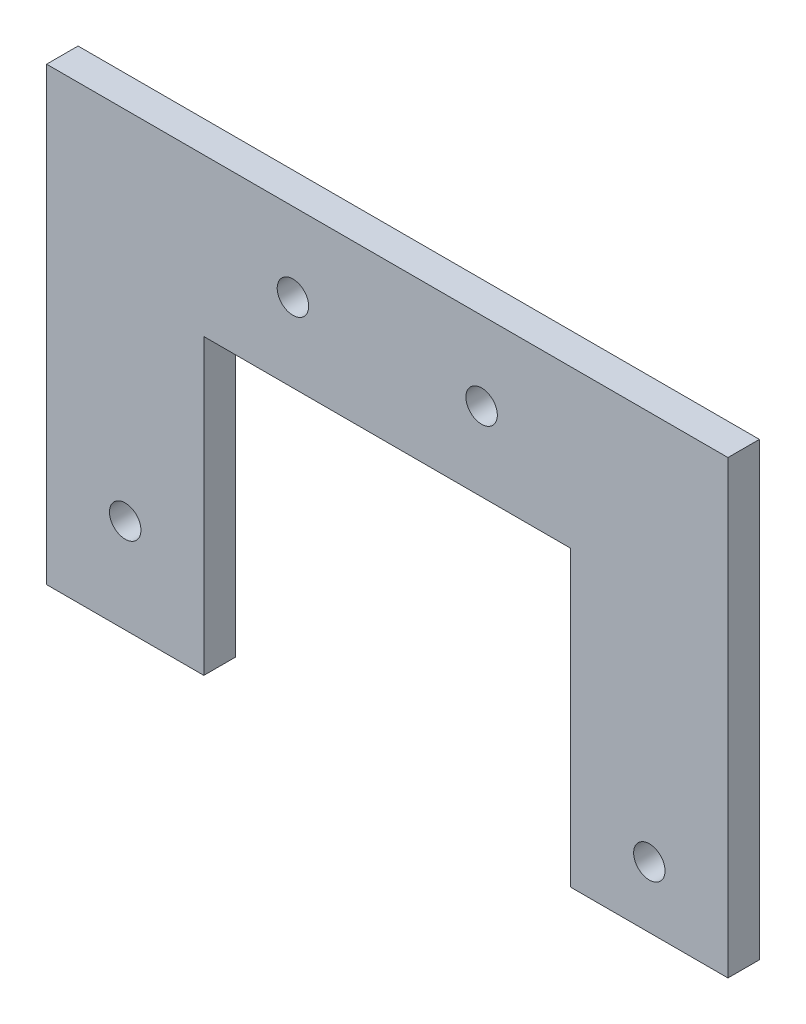
ISO-10303-21;
HEADER;
FILE_DESCRIPTION(('STEP AP214'),'2;1');
FILE_NAME('part.step','',(''),(''),'','','');
FILE_SCHEMA(('AUTOMOTIVE_DESIGN { 1 0 10303 214 1 1 1 1 }'));
ENDSEC;
DATA;
#1=APPLICATION_CONTEXT('core data for automotive mechanical design processes');
#2=APPLICATION_PROTOCOL_DEFINITION('international standard','automotive_design',2000,#1);
#3=PRODUCT_CONTEXT('',#1,'mechanical');
#4=PRODUCT('Part','Part','',(#3));
#5=PRODUCT_RELATED_PRODUCT_CATEGORY('part','',(#4));
#6=PRODUCT_DEFINITION_FORMATION('','',#4);
#7=PRODUCT_DEFINITION_CONTEXT('part definition',#1,'design');
#8=PRODUCT_DEFINITION('design','',#6,#7);
#9=PRODUCT_DEFINITION_SHAPE('','',#8);
#10=(LENGTH_UNIT() NAMED_UNIT(*) SI_UNIT(.MILLI.,.METRE.));
#11=(NAMED_UNIT(*) PLANE_ANGLE_UNIT() SI_UNIT($,.RADIAN.));
#12=(NAMED_UNIT(*) SI_UNIT($,.STERADIAN.) SOLID_ANGLE_UNIT());
#13=UNCERTAINTY_MEASURE_WITH_UNIT(LENGTH_MEASURE(1.E-05),#10,'distance_accuracy_value','');
#14=(GEOMETRIC_REPRESENTATION_CONTEXT(3) GLOBAL_UNCERTAINTY_ASSIGNED_CONTEXT((#13)) GLOBAL_UNIT_ASSIGNED_CONTEXT((#10,
#11,#12)) REPRESENTATION_CONTEXT('',''));
#15=CARTESIAN_POINT('',(0.,0.,0.));
#16=DIRECTION('',(0.,0.,1.));
#17=DIRECTION('',(1.,0.,0.));
#18=AXIS2_PLACEMENT_3D('',#15,#16,#17);
#19=CARTESIAN_POINT('',(0.,-43.,3.));
#20=DIRECTION('',(1.,0.,0.));
#21=DIRECTION('',(0.,0.,-1.));
#22=AXIS2_PLACEMENT_3D('',#19,#20,#21);
#23=PLANE('',#22);
#24=DIRECTION('',(0.,-1.,0.));
#25=VECTOR('',#24,1.);
#26=CARTESIAN_POINT('',(0.,-43.,0.));
#27=LINE('',#26,#25);
#28=CARTESIAN_POINT('',(0.,0.,0.));
#29=VERTEX_POINT('',#28);
#30=CARTESIAN_POINT('',(0.,-43.,0.));
#31=VERTEX_POINT('',#30);
#32=EDGE_CURVE('E135',#29,#31,#27,.T.);
#33=ORIENTED_EDGE('',*,*,#32,.T.);
#34=DIRECTION('',(0.,0.,-1.));
#35=VECTOR('',#34,1.);
#36=CARTESIAN_POINT('',(0.,-43.,3.));
#37=LINE('',#36,#35);
#38=CARTESIAN_POINT('',(0.,-43.,3.));
#39=VERTEX_POINT('',#38);
#40=EDGE_CURVE('E11',#39,#31,#37,.T.);
#41=ORIENTED_EDGE('',*,*,#40,.F.);
#42=DIRECTION('',(0.,-1.,0.));
#43=VECTOR('',#42,1.);
#44=CARTESIAN_POINT('',(0.,-43.,3.));
#45=LINE('',#44,#43);
#46=CARTESIAN_POINT('',(0.,0.,3.));
#47=VERTEX_POINT('',#46);
#48=EDGE_CURVE('E150',#47,#39,#45,.T.);
#49=ORIENTED_EDGE('',*,*,#48,.F.);
#50=DIRECTION('',(0.,0.,-1.));
#51=VECTOR('',#50,1.);
#52=CARTESIAN_POINT('',(0.,0.,3.));
#53=LINE('',#52,#51);
#54=EDGE_CURVE('E131',#47,#29,#53,.T.);
#55=ORIENTED_EDGE('',*,*,#54,.T.);
#56=EDGE_LOOP('',(#33,#41,#49,#55));
#57=FACE_BOUND('',#56,.T.);
#58=ADVANCED_FACE('F39',(#57),#23,.F.);
#59=CARTESIAN_POINT('',(15.,-43.,3.));
#60=DIRECTION('',(0.,1.,0.));
#61=DIRECTION('',(0.,0.,1.));
#62=AXIS2_PLACEMENT_3D('',#59,#60,#61);
#63=PLANE('',#62);
#64=DIRECTION('',(1.,0.,0.));
#65=VECTOR('',#64,1.);
#66=CARTESIAN_POINT('',(15.,-43.,0.));
#67=LINE('',#66,#65);
#68=CARTESIAN_POINT('',(15.,-43.,0.));
#69=VERTEX_POINT('',#68);
#70=EDGE_CURVE('E138',#31,#69,#67,.T.);
#71=ORIENTED_EDGE('',*,*,#70,.T.);
#72=DIRECTION('',(0.,0.,-1.));
#73=VECTOR('',#72,1.);
#74=CARTESIAN_POINT('',(15.,-43.,3.));
#75=LINE('',#74,#73);
#76=CARTESIAN_POINT('',(15.,-43.,3.));
#77=VERTEX_POINT('',#76);
#78=EDGE_CURVE('E47',#77,#69,#75,.T.);
#79=ORIENTED_EDGE('',*,*,#78,.F.);
#80=DIRECTION('',(1.,0.,0.));
#81=VECTOR('',#80,1.);
#82=CARTESIAN_POINT('',(15.,-43.,3.));
#83=LINE('',#82,#81);
#84=EDGE_CURVE('E98',#39,#77,#83,.T.);
#85=ORIENTED_EDGE('',*,*,#84,.F.);
#86=ORIENTED_EDGE('',*,*,#40,.T.);
#87=EDGE_LOOP('',(#71,#79,#85,#86));
#88=FACE_BOUND('',#87,.T.);
#89=ADVANCED_FACE('F240',(#88),#63,.F.);
#90=CARTESIAN_POINT('',(15.,-15.,3.));
#91=DIRECTION('',(-1.,0.,0.));
#92=DIRECTION('',(0.,-1.,0.));
#93=AXIS2_PLACEMENT_3D('',#90,#91,#92);
#94=PLANE('',#93);
#95=DIRECTION('',(0.,1.,0.));
#96=VECTOR('',#95,1.);
#97=CARTESIAN_POINT('',(15.,-15.,0.));
#98=LINE('',#97,#96);
#99=CARTESIAN_POINT('',(15.,-15.,0.));
#100=VERTEX_POINT('',#99);
#101=EDGE_CURVE('E141',#69,#100,#98,.T.);
#102=ORIENTED_EDGE('',*,*,#101,.T.);
#103=DIRECTION('',(0.,0.,-1.));
#104=VECTOR('',#103,1.);
#105=CARTESIAN_POINT('',(15.,-15.,3.));
#106=LINE('',#105,#104);
#107=CARTESIAN_POINT('',(15.,-15.,3.));
#108=VERTEX_POINT('',#107);
#109=EDGE_CURVE('E157',#108,#100,#106,.T.);
#110=ORIENTED_EDGE('',*,*,#109,.F.);
#111=DIRECTION('',(0.,1.,0.));
#112=VECTOR('',#111,1.);
#113=CARTESIAN_POINT('',(15.,-15.,3.));
#114=LINE('',#113,#112);
#115=EDGE_CURVE('E165',#77,#108,#114,.T.);
#116=ORIENTED_EDGE('',*,*,#115,.F.);
#117=ORIENTED_EDGE('',*,*,#78,.T.);
#118=EDGE_LOOP('',(#102,#110,#116,#117));
#119=FACE_BOUND('',#118,.T.);
#120=ADVANCED_FACE('F163',(#119),#94,.F.);
#121=CARTESIAN_POINT('',(50.,-15.,3.));
#122=DIRECTION('',(0.,1.,0.));
#123=DIRECTION('',(-1.,0.,0.));
#124=AXIS2_PLACEMENT_3D('',#121,#122,#123);
#125=PLANE('',#124);
#126=DIRECTION('',(1.,0.,0.));
#127=VECTOR('',#126,1.);
#128=CARTESIAN_POINT('',(50.,-15.,0.));
#129=LINE('',#128,#127);
#130=CARTESIAN_POINT('',(50.,-15.,0.));
#131=VERTEX_POINT('',#130);
#132=EDGE_CURVE('E143',#100,#131,#129,.T.);
#133=ORIENTED_EDGE('',*,*,#132,.T.);
#134=DIRECTION('',(0.,0.,-1.));
#135=VECTOR('',#134,1.);
#136=CARTESIAN_POINT('',(50.,-15.,3.));
#137=LINE('',#136,#135);
#138=CARTESIAN_POINT('',(50.,-15.,3.));
#139=VERTEX_POINT('',#138);
#140=EDGE_CURVE('E154',#139,#131,#137,.T.);
#141=ORIENTED_EDGE('',*,*,#140,.F.);
#142=DIRECTION('',(1.,0.,0.));
#143=VECTOR('',#142,1.);
#144=CARTESIAN_POINT('',(50.,-15.,3.));
#145=LINE('',#144,#143);
#146=EDGE_CURVE('E177',#108,#139,#145,.T.);
#147=ORIENTED_EDGE('',*,*,#146,.F.);
#148=ORIENTED_EDGE('',*,*,#109,.T.);
#149=EDGE_LOOP('',(#133,#141,#147,#148));
#150=FACE_BOUND('',#149,.T.);
#151=ADVANCED_FACE('F173',(#150),#125,.F.);
#152=CARTESIAN_POINT('',(50.,-43.,3.));
#153=DIRECTION('',(1.,0.,0.));
#154=DIRECTION('',(0.,0.,-1.));
#155=AXIS2_PLACEMENT_3D('',#152,#153,#154);
#156=PLANE('',#155);
#157=DIRECTION('',(0.,-1.,0.));
#158=VECTOR('',#157,1.);
#159=CARTESIAN_POINT('',(50.,-43.,0.));
#160=LINE('',#159,#158);
#161=CARTESIAN_POINT('',(50.,-43.,0.));
#162=VERTEX_POINT('',#161);
#163=EDGE_CURVE('E145',#131,#162,#160,.T.);
#164=ORIENTED_EDGE('',*,*,#163,.T.);
#165=DIRECTION('',(0.,0.,-1.));
#166=VECTOR('',#165,1.);
#167=CARTESIAN_POINT('',(50.,-43.,3.));
#168=LINE('',#167,#166);
#169=CARTESIAN_POINT('',(50.,-43.,3.));
#170=VERTEX_POINT('',#169);
#171=EDGE_CURVE('E126',#170,#162,#168,.T.);
#172=ORIENTED_EDGE('',*,*,#171,.F.);
#173=DIRECTION('',(0.,-1.,0.));
#174=VECTOR('',#173,1.);
#175=CARTESIAN_POINT('',(50.,-43.,3.));
#176=LINE('',#175,#174);
#177=EDGE_CURVE('E117',#139,#170,#176,.T.);
#178=ORIENTED_EDGE('',*,*,#177,.F.);
#179=ORIENTED_EDGE('',*,*,#140,.T.);
#180=EDGE_LOOP('',(#164,#172,#178,#179));
#181=FACE_BOUND('',#180,.T.);
#182=ADVANCED_FACE('F176',(#181),#156,.F.);
#183=CARTESIAN_POINT('',(65.,-43.,3.));
#184=DIRECTION('',(0.,1.,0.));
#185=DIRECTION('',(0.,0.,1.));
#186=AXIS2_PLACEMENT_3D('',#183,#184,#185);
#187=PLANE('',#186);
#188=DIRECTION('',(1.,0.,0.));
#189=VECTOR('',#188,1.);
#190=CARTESIAN_POINT('',(65.,-43.,0.));
#191=LINE('',#190,#189);
#192=CARTESIAN_POINT('',(65.,-43.,0.));
#193=VERTEX_POINT('',#192);
#194=EDGE_CURVE('E125',#162,#193,#191,.T.);
#195=ORIENTED_EDGE('',*,*,#194,.T.);
#196=DIRECTION('',(0.,0.,-1.));
#197=VECTOR('',#196,1.);
#198=CARTESIAN_POINT('',(65.,-43.,3.));
#199=LINE('',#198,#197);
#200=CARTESIAN_POINT('',(65.,-43.,3.));
#201=VERTEX_POINT('',#200);
#202=EDGE_CURVE('E122',#201,#193,#199,.T.);
#203=ORIENTED_EDGE('',*,*,#202,.F.);
#204=DIRECTION('',(1.,0.,0.));
#205=VECTOR('',#204,1.);
#206=CARTESIAN_POINT('',(65.,-43.,3.));
#207=LINE('',#206,#205);
#208=EDGE_CURVE('E111',#170,#201,#207,.T.);
#209=ORIENTED_EDGE('',*,*,#208,.F.);
#210=ORIENTED_EDGE('',*,*,#171,.T.);
#211=EDGE_LOOP('',(#195,#203,#209,#210));
#212=FACE_BOUND('',#211,.T.);
#213=ADVANCED_FACE('F123',(#212),#187,.F.);
#214=CARTESIAN_POINT('',(65.,0.,3.));
#215=DIRECTION('',(-1.,0.,0.));
#216=DIRECTION('',(0.,0.,1.));
#217=AXIS2_PLACEMENT_3D('',#214,#215,#216);
#218=PLANE('',#217);
#219=DIRECTION('',(0.,1.,0.));
#220=VECTOR('',#219,1.);
#221=CARTESIAN_POINT('',(65.,0.,0.));
#222=LINE('',#221,#220);
#223=CARTESIAN_POINT('',(65.,0.,0.));
#224=VERTEX_POINT('',#223);
#225=EDGE_CURVE('E84',#193,#224,#222,.T.);
#226=ORIENTED_EDGE('',*,*,#225,.T.);
#227=DIRECTION('',(0.,0.,-1.));
#228=VECTOR('',#227,1.);
#229=CARTESIAN_POINT('',(65.,0.,3.));
#230=LINE('',#229,#228);
#231=CARTESIAN_POINT('',(65.,0.,3.));
#232=VERTEX_POINT('',#231);
#233=EDGE_CURVE('E127',#232,#224,#230,.T.);
#234=ORIENTED_EDGE('',*,*,#233,.F.);
#235=DIRECTION('',(0.,1.,0.));
#236=VECTOR('',#235,1.);
#237=CARTESIAN_POINT('',(65.,0.,3.));
#238=LINE('',#237,#236);
#239=EDGE_CURVE('E115',#201,#232,#238,.T.);
#240=ORIENTED_EDGE('',*,*,#239,.F.);
#241=ORIENTED_EDGE('',*,*,#202,.T.);
#242=EDGE_LOOP('',(#226,#234,#240,#241));
#243=FACE_BOUND('',#242,.T.);
#244=ADVANCED_FACE('F129',(#243),#218,.F.);
#245=CARTESIAN_POINT('',(0.,0.,3.));
#246=DIRECTION('',(0.,-1.,0.));
#247=DIRECTION('',(0.,0.,-1.));
#248=AXIS2_PLACEMENT_3D('',#245,#246,#247);
#249=PLANE('',#248);
#250=DIRECTION('',(-1.,0.,0.));
#251=VECTOR('',#250,1.);
#252=CARTESIAN_POINT('',(0.,0.,0.));
#253=LINE('',#252,#251);
#254=EDGE_CURVE('E90',#224,#29,#253,.T.);
#255=ORIENTED_EDGE('',*,*,#254,.T.);
#256=ORIENTED_EDGE('',*,*,#54,.F.);
#257=DIRECTION('',(-1.,0.,0.));
#258=VECTOR('',#257,1.);
#259=CARTESIAN_POINT('',(0.,0.,3.));
#260=LINE('',#259,#258);
#261=EDGE_CURVE('E55',#232,#47,#260,.T.);
#262=ORIENTED_EDGE('',*,*,#261,.F.);
#263=ORIENTED_EDGE('',*,*,#233,.T.);
#264=EDGE_LOOP('',(#255,#256,#262,#263));
#265=FACE_BOUND('',#264,.T.);
#266=ADVANCED_FACE('F218',(#265),#249,.F.);
#267=CARTESIAN_POINT('',(0.,0.,3.));
#268=DIRECTION('',(0.,0.,-1.));
#269=DIRECTION('',(-1.,0.,0.));
#270=AXIS2_PLACEMENT_3D('',#267,#268,#269);
#271=PLANE('',#270);
#272=CARTESIAN_POINT('',(57.5,-37.1579511960323,3.));
#273=DIRECTION('',(0.,0.,1.));
#274=DIRECTION('',(1.,0.,0.));
#275=AXIS2_PLACEMENT_3D('',#272,#273,#274);
#276=CIRCLE('',#275,1.5);
#277=CARTESIAN_POINT('',(59.,-37.1579511960323,3.));
#278=VERTEX_POINT('',#277);
#279=EDGE_CURVE('E201',#278,#278,#276,.T.);
#280=ORIENTED_EDGE('',*,*,#279,.F.);
#281=EDGE_LOOP('',(#280));
#282=FACE_BOUND('',#281,.T.);
#283=CARTESIAN_POINT('',(7.5,-34.,3.));
#284=DIRECTION('',(0.,0.,1.));
#285=DIRECTION('',(1.,0.,0.));
#286=AXIS2_PLACEMENT_3D('',#283,#284,#285);
#287=CIRCLE('',#286,1.5);
#288=CARTESIAN_POINT('',(9.,-34.,3.));
#289=VERTEX_POINT('',#288);
#290=EDGE_CURVE('E195',#289,#289,#287,.T.);
#291=ORIENTED_EDGE('',*,*,#290,.F.);
#292=EDGE_LOOP('',(#291));
#293=FACE_BOUND('',#292,.T.);
#294=CARTESIAN_POINT('',(23.5,-7.5,3.));
#295=DIRECTION('',(0.,0.,1.));
#296=DIRECTION('',(1.,0.,0.));
#297=AXIS2_PLACEMENT_3D('',#294,#295,#296);
#298=CIRCLE('',#297,1.5);
#299=CARTESIAN_POINT('',(25.,-7.5,3.));
#300=VERTEX_POINT('',#299);
#301=EDGE_CURVE('E189',#300,#300,#298,.T.);
#302=ORIENTED_EDGE('',*,*,#301,.F.);
#303=EDGE_LOOP('',(#302));
#304=FACE_BOUND('',#303,.T.);
#305=CARTESIAN_POINT('',(41.5,-7.5,3.));
#306=DIRECTION('',(0.,0.,1.));
#307=DIRECTION('',(1.,0.,0.));
#308=AXIS2_PLACEMENT_3D('',#305,#306,#307);
#309=CIRCLE('',#308,1.5);
#310=CARTESIAN_POINT('',(43.,-7.5,3.));
#311=VERTEX_POINT('',#310);
#312=EDGE_CURVE('E183',#311,#311,#309,.T.);
#313=ORIENTED_EDGE('',*,*,#312,.F.);
#314=EDGE_LOOP('',(#313));
#315=FACE_BOUND('',#314,.T.);
#316=ORIENTED_EDGE('',*,*,#48,.T.);
#317=ORIENTED_EDGE('',*,*,#84,.T.);
#318=ORIENTED_EDGE('',*,*,#115,.T.);
#319=ORIENTED_EDGE('',*,*,#146,.T.);
#320=ORIENTED_EDGE('',*,*,#177,.T.);
#321=ORIENTED_EDGE('',*,*,#208,.T.);
#322=ORIENTED_EDGE('',*,*,#239,.T.);
#323=ORIENTED_EDGE('',*,*,#261,.T.);
#324=EDGE_LOOP('',(#316,#317,#318,#319,#320,#321,#322,#323));
#325=FACE_BOUND('',#324,.T.);
#326=ADVANCED_FACE('F113',(#282,#293,#304,#315,#325),#271,.F.);
#327=CARTESIAN_POINT('',(0.,0.,0.));
#328=DIRECTION('',(0.,0.,-1.));
#329=DIRECTION('',(-1.,0.,0.));
#330=AXIS2_PLACEMENT_3D('',#327,#328,#329);
#331=PLANE('',#330);
#332=CARTESIAN_POINT('',(57.5,-37.1579511960323,0.));
#333=DIRECTION('',(0.,0.,1.));
#334=DIRECTION('',(1.,0.,0.));
#335=AXIS2_PLACEMENT_3D('',#332,#333,#334);
#336=CIRCLE('',#335,1.5);
#337=CARTESIAN_POINT('',(59.,-37.1579511960323,0.));
#338=VERTEX_POINT('',#337);
#339=EDGE_CURVE('E139',#338,#338,#336,.T.);
#340=ORIENTED_EDGE('',*,*,#339,.T.);
#341=EDGE_LOOP('',(#340));
#342=FACE_BOUND('',#341,.T.);
#343=CARTESIAN_POINT('',(7.5,-34.,0.));
#344=DIRECTION('',(0.,0.,1.));
#345=DIRECTION('',(1.,0.,0.));
#346=AXIS2_PLACEMENT_3D('',#343,#344,#345);
#347=CIRCLE('',#346,1.5);
#348=CARTESIAN_POINT('',(9.,-34.,0.));
#349=VERTEX_POINT('',#348);
#350=EDGE_CURVE('E198',#349,#349,#347,.T.);
#351=ORIENTED_EDGE('',*,*,#350,.T.);
#352=EDGE_LOOP('',(#351));
#353=FACE_BOUND('',#352,.T.);
#354=CARTESIAN_POINT('',(23.5,-7.5,0.));
#355=DIRECTION('',(0.,0.,1.));
#356=DIRECTION('',(1.,0.,0.));
#357=AXIS2_PLACEMENT_3D('',#354,#355,#356);
#358=CIRCLE('',#357,1.5);
#359=CARTESIAN_POINT('',(25.,-7.5,0.));
#360=VERTEX_POINT('',#359);
#361=EDGE_CURVE('E192',#360,#360,#358,.T.);
#362=ORIENTED_EDGE('',*,*,#361,.T.);
#363=EDGE_LOOP('',(#362));
#364=FACE_BOUND('',#363,.T.);
#365=CARTESIAN_POINT('',(41.5,-7.5,0.));
#366=DIRECTION('',(0.,0.,1.));
#367=DIRECTION('',(1.,0.,0.));
#368=AXIS2_PLACEMENT_3D('',#365,#366,#367);
#369=CIRCLE('',#368,1.5);
#370=CARTESIAN_POINT('',(43.,-7.5,0.));
#371=VERTEX_POINT('',#370);
#372=EDGE_CURVE('E186',#371,#371,#369,.T.);
#373=ORIENTED_EDGE('',*,*,#372,.T.);
#374=EDGE_LOOP('',(#373));
#375=FACE_BOUND('',#374,.T.);
#376=ORIENTED_EDGE('',*,*,#32,.F.);
#377=ORIENTED_EDGE('',*,*,#254,.F.);
#378=ORIENTED_EDGE('',*,*,#225,.F.);
#379=ORIENTED_EDGE('',*,*,#194,.F.);
#380=ORIENTED_EDGE('',*,*,#163,.F.);
#381=ORIENTED_EDGE('',*,*,#132,.F.);
#382=ORIENTED_EDGE('',*,*,#101,.F.);
#383=ORIENTED_EDGE('',*,*,#70,.F.);
#384=EDGE_LOOP('',(#376,#377,#378,#379,#380,#381,#382,#383));
#385=FACE_BOUND('',#384,.T.);
#386=ADVANCED_FACE('F169',(#342,#353,#364,#375,#385),#331,.T.);
#387=CARTESIAN_POINT('',(41.5,-7.5,0.));
#388=DIRECTION('',(0.,0.,1.));
#389=DIRECTION('',(1.,0.,0.));
#390=AXIS2_PLACEMENT_3D('',#387,#388,#389);
#391=CYLINDRICAL_SURFACE('',#390,1.5);
#392=ORIENTED_EDGE('',*,*,#372,.F.);
#393=EDGE_LOOP('',(#392));
#394=FACE_BOUND('',#393,.T.);
#395=ORIENTED_EDGE('',*,*,#312,.T.);
#396=EDGE_LOOP('',(#395));
#397=FACE_BOUND('',#396,.T.);
#398=ADVANCED_FACE('F226',(#394,#397),#391,.F.);
#399=CARTESIAN_POINT('',(23.5,-7.5,0.));
#400=DIRECTION('',(0.,0.,1.));
#401=DIRECTION('',(1.,0.,0.));
#402=AXIS2_PLACEMENT_3D('',#399,#400,#401);
#403=CYLINDRICAL_SURFACE('',#402,1.5);
#404=ORIENTED_EDGE('',*,*,#361,.F.);
#405=EDGE_LOOP('',(#404));
#406=FACE_BOUND('',#405,.T.);
#407=ORIENTED_EDGE('',*,*,#301,.T.);
#408=EDGE_LOOP('',(#407));
#409=FACE_BOUND('',#408,.T.);
#410=ADVANCED_FACE('F228',(#406,#409),#403,.F.);
#411=CARTESIAN_POINT('',(7.5,-34.,0.));
#412=DIRECTION('',(0.,0.,1.));
#413=DIRECTION('',(1.,0.,0.));
#414=AXIS2_PLACEMENT_3D('',#411,#412,#413);
#415=CYLINDRICAL_SURFACE('',#414,1.5);
#416=ORIENTED_EDGE('',*,*,#350,.F.);
#417=EDGE_LOOP('',(#416));
#418=FACE_BOUND('',#417,.T.);
#419=ORIENTED_EDGE('',*,*,#290,.T.);
#420=EDGE_LOOP('',(#419));
#421=FACE_BOUND('',#420,.T.);
#422=ADVANCED_FACE('F212',(#418,#421),#415,.F.);
#423=CARTESIAN_POINT('',(57.5,-37.1579511960323,0.));
#424=DIRECTION('',(0.,0.,1.));
#425=DIRECTION('',(1.,0.,0.));
#426=AXIS2_PLACEMENT_3D('',#423,#424,#425);
#427=CYLINDRICAL_SURFACE('',#426,1.5);
#428=ORIENTED_EDGE('',*,*,#339,.F.);
#429=EDGE_LOOP('',(#428));
#430=FACE_BOUND('',#429,.T.);
#431=ORIENTED_EDGE('',*,*,#279,.T.);
#432=EDGE_LOOP('',(#431));
#433=FACE_BOUND('',#432,.T.);
#434=ADVANCED_FACE('F209',(#430,#433),#427,.F.);
#435=CLOSED_SHELL('',(#58,#89,#120,#151,#182,#213,#244,#266,#326,#386,#398,#410,#422,#434));
#436=MANIFOLD_SOLID_BREP('B2',#435);
#437=ADVANCED_BREP_SHAPE_REPRESENTATION('',(#18,#436),#14);
#438=SHAPE_DEFINITION_REPRESENTATION(#9,#437);
ENDSEC;
END-ISO-10303-21;
